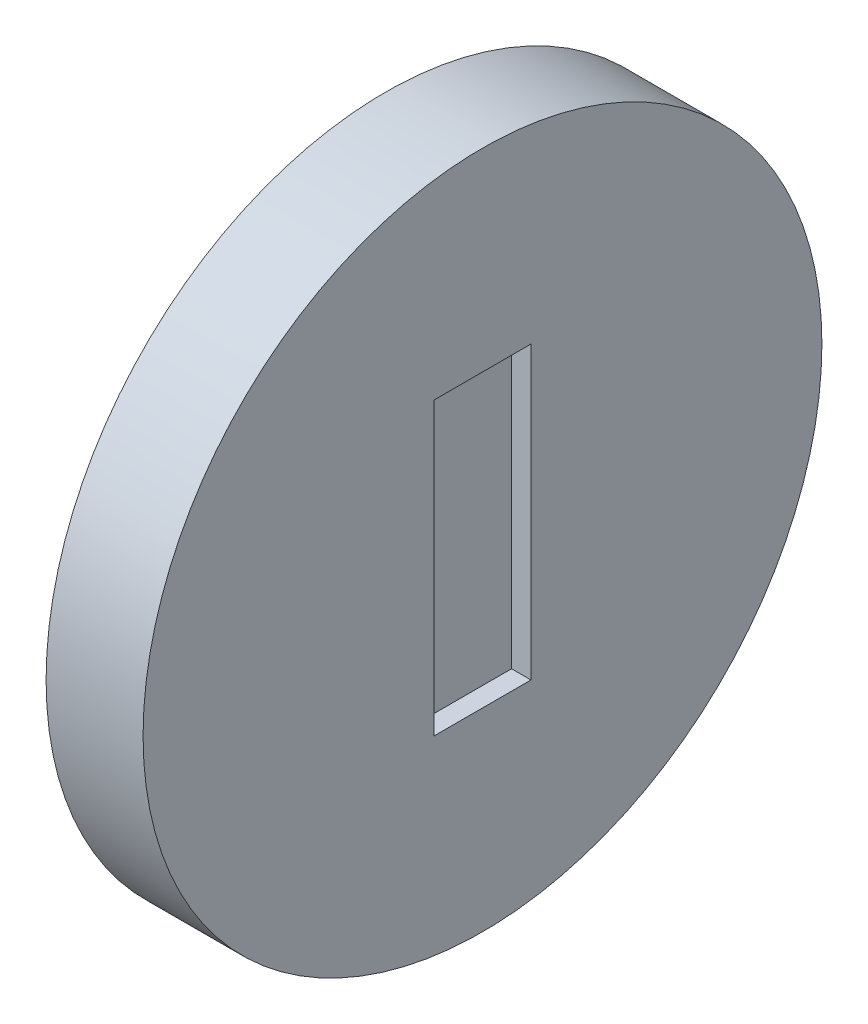
ISO-10303-21;
HEADER;
FILE_DESCRIPTION(('STEP AP214'),'2;1');
FILE_NAME('part.step','',(''),(''),'','','');
FILE_SCHEMA(('AUTOMOTIVE_DESIGN { 1 0 10303 214 1 1 1 1 }'));
ENDSEC;
DATA;
#1=APPLICATION_CONTEXT('core data for automotive mechanical design processes');
#2=APPLICATION_PROTOCOL_DEFINITION('international standard','automotive_design',2000,#1);
#3=PRODUCT_CONTEXT('',#1,'mechanical');
#4=PRODUCT('Part','Part','',(#3));
#5=PRODUCT_RELATED_PRODUCT_CATEGORY('part','',(#4));
#6=PRODUCT_DEFINITION_FORMATION('','',#4);
#7=PRODUCT_DEFINITION_CONTEXT('part definition',#1,'design');
#8=PRODUCT_DEFINITION('design','',#6,#7);
#9=PRODUCT_DEFINITION_SHAPE('','',#8);
#10=(LENGTH_UNIT() NAMED_UNIT(*) SI_UNIT(.MILLI.,.METRE.));
#11=(NAMED_UNIT(*) PLANE_ANGLE_UNIT() SI_UNIT($,.RADIAN.));
#12=(NAMED_UNIT(*) SI_UNIT($,.STERADIAN.) SOLID_ANGLE_UNIT());
#13=UNCERTAINTY_MEASURE_WITH_UNIT(LENGTH_MEASURE(1.E-05),#10,'distance_accuracy_value','');
#14=(GEOMETRIC_REPRESENTATION_CONTEXT(3) GLOBAL_UNCERTAINTY_ASSIGNED_CONTEXT((#13)) GLOBAL_UNIT_ASSIGNED_CONTEXT((#10,
#11,#12)) REPRESENTATION_CONTEXT('',''));
#15=CARTESIAN_POINT('',(0.,0.,0.));
#16=DIRECTION('',(0.,0.,1.));
#17=DIRECTION('',(1.,0.,0.));
#18=AXIS2_PLACEMENT_3D('',#15,#16,#17);
#19=CARTESIAN_POINT('',(0.,0.,0.));
#20=DIRECTION('',(1.,0.,0.));
#21=DIRECTION('',(0.,0.,-1.));
#22=AXIS2_PLACEMENT_3D('',#19,#20,#21);
#23=PLANE('',#22);
#24=CARTESIAN_POINT('',(0.,0.,0.));
#25=DIRECTION('',(1.,0.,0.));
#26=DIRECTION('',(0.,0.,-1.));
#27=AXIS2_PLACEMENT_3D('',#24,#25,#26);
#28=CIRCLE('',#27,17.5);
#29=CARTESIAN_POINT('',(0.,0.,-17.5));
#30=VERTEX_POINT('',#29);
#31=EDGE_CURVE('E41',#30,#30,#28,.T.);
#32=ORIENTED_EDGE('',*,*,#31,.T.);
#33=EDGE_LOOP('',(#32));
#34=FACE_BOUND('',#33,.T.);
#35=DIRECTION('',(0.,0.,1.));
#36=VECTOR('',#35,1.);
#37=CARTESIAN_POINT('',(0.,-7.5,0.));
#38=LINE('',#37,#36);
#39=CARTESIAN_POINT('',(0.,-7.5,-2.5));
#40=VERTEX_POINT('',#39);
#41=CARTESIAN_POINT('',(0.,-7.5,2.5));
#42=VERTEX_POINT('',#41);
#43=EDGE_CURVE('E84',#40,#42,#38,.T.);
#44=ORIENTED_EDGE('',*,*,#43,.T.);
#45=DIRECTION('',(0.,1.,0.));
#46=VECTOR('',#45,1.);
#47=CARTESIAN_POINT('',(0.,0.,2.5));
#48=LINE('',#47,#46);
#49=CARTESIAN_POINT('',(0.,7.5,2.5));
#50=VERTEX_POINT('',#49);
#51=EDGE_CURVE('E52',#42,#50,#48,.T.);
#52=ORIENTED_EDGE('',*,*,#51,.T.);
#53=DIRECTION('',(0.,0.,1.));
#54=VECTOR('',#53,1.);
#55=CARTESIAN_POINT('',(0.,7.5,0.));
#56=LINE('',#55,#54);
#57=CARTESIAN_POINT('',(0.,7.5,-2.5));
#58=VERTEX_POINT('',#57);
#59=EDGE_CURVE('E109',#58,#50,#56,.T.);
#60=ORIENTED_EDGE('',*,*,#59,.F.);
#61=DIRECTION('',(0.,1.,0.));
#62=VECTOR('',#61,1.);
#63=CARTESIAN_POINT('',(0.,0.,-2.5));
#64=LINE('',#63,#62);
#65=EDGE_CURVE('E107',#40,#58,#64,.T.);
#66=ORIENTED_EDGE('',*,*,#65,.F.);
#67=EDGE_LOOP('',(#44,#52,#60,#66));
#68=FACE_BOUND('',#67,.T.);
#69=ADVANCED_FACE('F37',(#34,#68),#23,.T.);
#70=CARTESIAN_POINT('',(-5.,0.,0.));
#71=DIRECTION('',(1.,0.,0.));
#72=DIRECTION('',(0.,0.,-1.));
#73=AXIS2_PLACEMENT_3D('',#70,#71,#72);
#74=CYLINDRICAL_SURFACE('',#73,17.5);
#75=CARTESIAN_POINT('',(-5.,0.,0.));
#76=DIRECTION('',(1.,0.,0.));
#77=DIRECTION('',(0.,0.,-1.));
#78=AXIS2_PLACEMENT_3D('',#75,#76,#77);
#79=CIRCLE('',#78,17.5);
#80=CARTESIAN_POINT('',(-5.,0.,-17.5));
#81=VERTEX_POINT('',#80);
#82=EDGE_CURVE('E11',#81,#81,#79,.T.);
#83=ORIENTED_EDGE('',*,*,#82,.T.);
#84=EDGE_LOOP('',(#83));
#85=FACE_BOUND('',#84,.T.);
#86=ORIENTED_EDGE('',*,*,#31,.F.);
#87=EDGE_LOOP('',(#86));
#88=FACE_BOUND('',#87,.T.);
#89=ADVANCED_FACE('F39',(#85,#88),#74,.T.);
#90=CARTESIAN_POINT('',(-5.,0.,0.));
#91=DIRECTION('',(1.,0.,0.));
#92=DIRECTION('',(0.,0.,-1.));
#93=AXIS2_PLACEMENT_3D('',#90,#91,#92);
#94=PLANE('',#93);
#95=ORIENTED_EDGE('',*,*,#82,.F.);
#96=EDGE_LOOP('',(#95));
#97=FACE_BOUND('',#96,.T.);
#98=ADVANCED_FACE('F125',(#97),#94,.F.);
#99=CARTESIAN_POINT('',(-1.,0.,2.5));
#100=DIRECTION('',(0.,0.,-1.));
#101=DIRECTION('',(-1.,0.,0.));
#102=AXIS2_PLACEMENT_3D('',#99,#100,#101);
#103=PLANE('',#102);
#104=ORIENTED_EDGE('',*,*,#51,.F.);
#105=DIRECTION('',(1.,0.,0.));
#106=VECTOR('',#105,1.);
#107=CARTESIAN_POINT('',(-1.,-7.5,2.5));
#108=LINE('',#107,#106);
#109=CARTESIAN_POINT('',(-1.,-7.5,2.5));
#110=VERTEX_POINT('',#109);
#111=EDGE_CURVE('E90',#110,#42,#108,.T.);
#112=ORIENTED_EDGE('',*,*,#111,.F.);
#113=DIRECTION('',(0.,1.,0.));
#114=VECTOR('',#113,1.);
#115=CARTESIAN_POINT('',(-1.,0.,2.5));
#116=LINE('',#115,#114);
#117=CARTESIAN_POINT('',(-1.,7.5,2.5));
#118=VERTEX_POINT('',#117);
#119=EDGE_CURVE('E58',#110,#118,#116,.T.);
#120=ORIENTED_EDGE('',*,*,#119,.T.);
#121=DIRECTION('',(1.,0.,0.));
#122=VECTOR('',#121,1.);
#123=CARTESIAN_POINT('',(-1.,7.5,2.5));
#124=LINE('',#123,#122);
#125=EDGE_CURVE('E72',#118,#50,#124,.T.);
#126=ORIENTED_EDGE('',*,*,#125,.T.);
#127=EDGE_LOOP('',(#104,#112,#120,#126));
#128=FACE_BOUND('',#127,.T.);
#129=ADVANCED_FACE('F118',(#128),#103,.T.);
#130=CARTESIAN_POINT('',(-1.,7.5,0.));
#131=DIRECTION('',(0.,1.,0.));
#132=DIRECTION('',(0.,0.,1.));
#133=AXIS2_PLACEMENT_3D('',#130,#131,#132);
#134=PLANE('',#133);
#135=ORIENTED_EDGE('',*,*,#59,.T.);
#136=ORIENTED_EDGE('',*,*,#125,.F.);
#137=DIRECTION('',(0.,0.,1.));
#138=VECTOR('',#137,1.);
#139=CARTESIAN_POINT('',(-1.,7.5,0.));
#140=LINE('',#139,#138);
#141=CARTESIAN_POINT('',(-1.,7.5,-2.5));
#142=VERTEX_POINT('',#141);
#143=EDGE_CURVE('E100',#142,#118,#140,.T.);
#144=ORIENTED_EDGE('',*,*,#143,.F.);
#145=DIRECTION('',(1.,0.,0.));
#146=VECTOR('',#145,1.);
#147=CARTESIAN_POINT('',(-1.,7.5,-2.5));
#148=LINE('',#147,#146);
#149=EDGE_CURVE('E89',#142,#58,#148,.T.);
#150=ORIENTED_EDGE('',*,*,#149,.T.);
#151=EDGE_LOOP('',(#135,#136,#144,#150));
#152=FACE_BOUND('',#151,.T.);
#153=ADVANCED_FACE('F116',(#152),#134,.F.);
#154=CARTESIAN_POINT('',(-1.,0.,-2.5));
#155=DIRECTION('',(0.,0.,-1.));
#156=DIRECTION('',(-1.,0.,0.));
#157=AXIS2_PLACEMENT_3D('',#154,#155,#156);
#158=PLANE('',#157);
#159=ORIENTED_EDGE('',*,*,#65,.T.);
#160=ORIENTED_EDGE('',*,*,#149,.F.);
#161=DIRECTION('',(0.,1.,0.));
#162=VECTOR('',#161,1.);
#163=CARTESIAN_POINT('',(-1.,0.,-2.5));
#164=LINE('',#163,#162);
#165=CARTESIAN_POINT('',(-1.,-7.5,-2.5));
#166=VERTEX_POINT('',#165);
#167=EDGE_CURVE('E96',#166,#142,#164,.T.);
#168=ORIENTED_EDGE('',*,*,#167,.F.);
#169=DIRECTION('',(1.,0.,0.));
#170=VECTOR('',#169,1.);
#171=CARTESIAN_POINT('',(-1.,-7.5,-2.5));
#172=LINE('',#171,#170);
#173=EDGE_CURVE('E81',#166,#40,#172,.T.);
#174=ORIENTED_EDGE('',*,*,#173,.T.);
#175=EDGE_LOOP('',(#159,#160,#168,#174));
#176=FACE_BOUND('',#175,.T.);
#177=ADVANCED_FACE('F99',(#176),#158,.F.);
#178=CARTESIAN_POINT('',(-1.,-7.5,0.));
#179=DIRECTION('',(0.,1.,0.));
#180=DIRECTION('',(0.,0.,1.));
#181=AXIS2_PLACEMENT_3D('',#178,#179,#180);
#182=PLANE('',#181);
#183=ORIENTED_EDGE('',*,*,#43,.F.);
#184=ORIENTED_EDGE('',*,*,#173,.F.);
#185=DIRECTION('',(0.,0.,1.));
#186=VECTOR('',#185,1.);
#187=CARTESIAN_POINT('',(-1.,-7.5,0.));
#188=LINE('',#187,#186);
#189=EDGE_CURVE('E79',#166,#110,#188,.T.);
#190=ORIENTED_EDGE('',*,*,#189,.T.);
#191=ORIENTED_EDGE('',*,*,#111,.T.);
#192=EDGE_LOOP('',(#183,#184,#190,#191));
#193=FACE_BOUND('',#192,.T.);
#194=ADVANCED_FACE('F82',(#193),#182,.T.);
#195=CARTESIAN_POINT('',(-1.,0.,0.));
#196=DIRECTION('',(1.,0.,0.));
#197=DIRECTION('',(0.,0.,-1.));
#198=AXIS2_PLACEMENT_3D('',#195,#196,#197);
#199=PLANE('',#198);
#200=ORIENTED_EDGE('',*,*,#119,.F.);
#201=ORIENTED_EDGE('',*,*,#189,.F.);
#202=ORIENTED_EDGE('',*,*,#167,.T.);
#203=ORIENTED_EDGE('',*,*,#143,.T.);
#204=EDGE_LOOP('',(#200,#201,#202,#203));
#205=FACE_BOUND('',#204,.T.);
#206=ADVANCED_FACE('F94',(#205),#199,.T.);
#207=CLOSED_SHELL('',(#69,#89,#98,#129,#153,#177,#194,#206));
#208=MANIFOLD_SOLID_BREP('B2',#207);
#209=ADVANCED_BREP_SHAPE_REPRESENTATION('',(#18,#208),#14);
#210=SHAPE_DEFINITION_REPRESENTATION(#9,#209);
ENDSEC;
END-ISO-10303-21;
